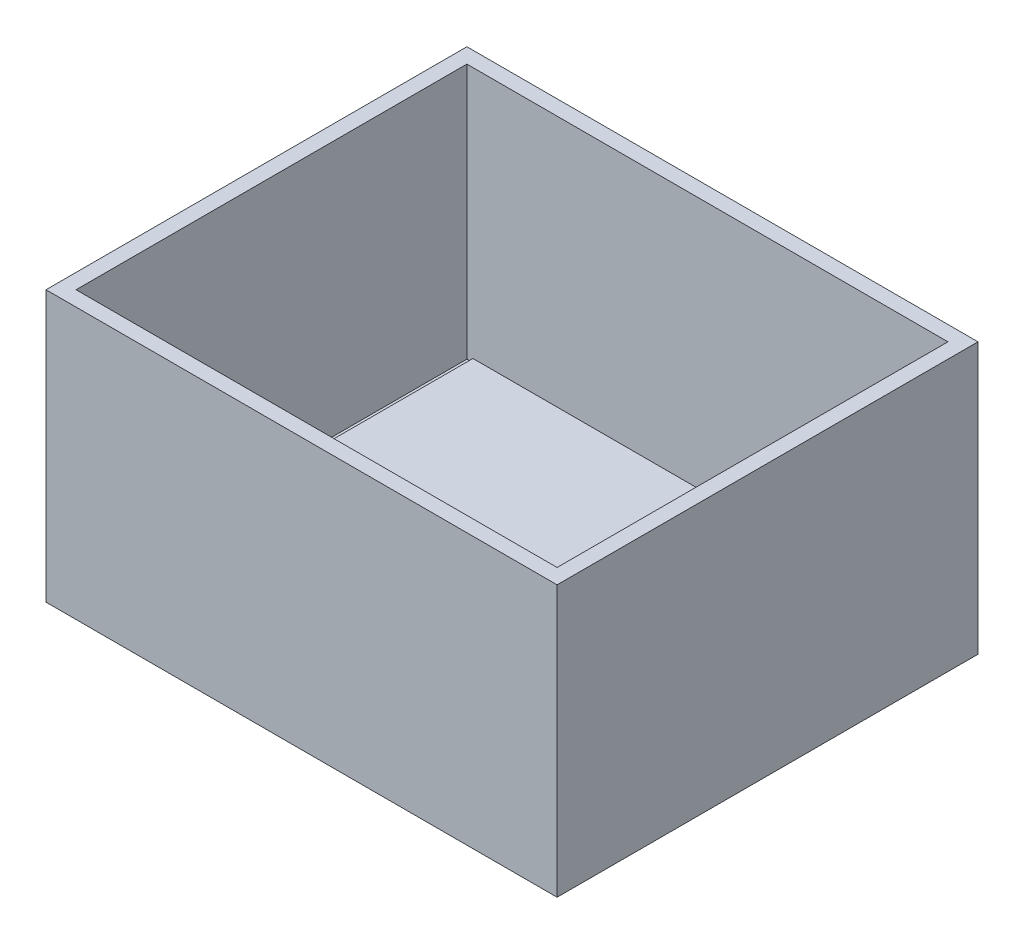
ISO-10303-21;
HEADER;
FILE_DESCRIPTION(('STEP AP214'),'2;1');
FILE_NAME('part.step','',(''),(''),'','','');
FILE_SCHEMA(('AUTOMOTIVE_DESIGN { 1 0 10303 214 1 1 1 1 }'));
ENDSEC;
DATA;
#1=APPLICATION_CONTEXT('core data for automotive mechanical design processes');
#2=APPLICATION_PROTOCOL_DEFINITION('international standard','automotive_design',2000,#1);
#3=PRODUCT_CONTEXT('',#1,'mechanical');
#4=PRODUCT('Part','Part','',(#3));
#5=PRODUCT_RELATED_PRODUCT_CATEGORY('part','',(#4));
#6=PRODUCT_DEFINITION_FORMATION('','',#4);
#7=PRODUCT_DEFINITION_CONTEXT('part definition',#1,'design');
#8=PRODUCT_DEFINITION('design','',#6,#7);
#9=PRODUCT_DEFINITION_SHAPE('','',#8);
#10=(LENGTH_UNIT() NAMED_UNIT(*) SI_UNIT(.MILLI.,.METRE.));
#11=(NAMED_UNIT(*) PLANE_ANGLE_UNIT() SI_UNIT($,.RADIAN.));
#12=(NAMED_UNIT(*) SI_UNIT($,.STERADIAN.) SOLID_ANGLE_UNIT());
#13=UNCERTAINTY_MEASURE_WITH_UNIT(LENGTH_MEASURE(1.E-05),#10,'distance_accuracy_value','');
#14=(GEOMETRIC_REPRESENTATION_CONTEXT(3) GLOBAL_UNCERTAINTY_ASSIGNED_CONTEXT((#13)) GLOBAL_UNIT_ASSIGNED_CONTEXT((#10,
#11,#12)) REPRESENTATION_CONTEXT('',''));
#15=CARTESIAN_POINT('',(0.,0.,0.));
#16=DIRECTION('',(0.,0.,1.));
#17=DIRECTION('',(1.,0.,0.));
#18=AXIS2_PLACEMENT_3D('',#15,#16,#17);
#19=CARTESIAN_POINT('',(241.6,6.,105.4));
#20=DIRECTION('',(0.,0.,-1.));
#21=DIRECTION('',(-1.,0.,0.));
#22=AXIS2_PLACEMENT_3D('',#19,#20,#21);
#23=PLANE('',#22);
#24=DIRECTION('',(0.,-1.,0.));
#25=VECTOR('',#24,1.);
#26=CARTESIAN_POINT('',(173.,6.,105.4));
#27=LINE('',#26,#25);
#28=CARTESIAN_POINT('',(173.,7.6,105.4));
#29=VERTEX_POINT('',#28);
#30=CARTESIAN_POINT('',(173.,6.,105.4));
#31=VERTEX_POINT('',#30);
#32=EDGE_CURVE('E114',#29,#31,#27,.T.);
#33=ORIENTED_EDGE('',*,*,#32,.T.);
#34=DIRECTION('',(-1.,0.,0.));
#35=VECTOR('',#34,1.);
#36=CARTESIAN_POINT('',(241.6,6.,105.4));
#37=LINE('',#36,#35);
#38=CARTESIAN_POINT('',(241.6,6.,105.4));
#39=VERTEX_POINT('',#38);
#40=EDGE_CURVE('E12',#39,#31,#37,.T.);
#41=ORIENTED_EDGE('',*,*,#40,.F.);
#42=DIRECTION('',(0.,-1.,0.));
#43=VECTOR('',#42,1.);
#44=CARTESIAN_POINT('',(241.6,6.,105.4));
#45=LINE('',#44,#43);
#46=CARTESIAN_POINT('',(241.6,7.6,105.4));
#47=VERTEX_POINT('',#46);
#48=EDGE_CURVE('E102',#47,#39,#45,.T.);
#49=ORIENTED_EDGE('',*,*,#48,.F.);
#50=DIRECTION('',(-1.,0.,0.));
#51=VECTOR('',#50,1.);
#52=CARTESIAN_POINT('',(241.6,7.6,105.4));
#53=LINE('',#52,#51);
#54=EDGE_CURVE('E110',#47,#29,#53,.T.);
#55=ORIENTED_EDGE('',*,*,#54,.T.);
#56=EDGE_LOOP('',(#33,#41,#49,#55));
#57=FACE_BOUND('',#56,.T.);
#58=ADVANCED_FACE('F51',(#57),#23,.F.);
#59=CARTESIAN_POINT('',(241.6,6.,52.));
#60=DIRECTION('',(0.,1.,0.));
#61=DIRECTION('',(0.,0.,1.));
#62=AXIS2_PLACEMENT_3D('',#59,#60,#61);
#63=PLANE('',#62);
#64=DIRECTION('',(0.,0.,-1.));
#65=VECTOR('',#64,1.);
#66=CARTESIAN_POINT('',(173.,6.,52.));
#67=LINE('',#66,#65);
#68=CARTESIAN_POINT('',(173.,6.,52.));
#69=VERTEX_POINT('',#68);
#70=EDGE_CURVE('E106',#31,#69,#67,.T.);
#71=ORIENTED_EDGE('',*,*,#70,.T.);
#72=DIRECTION('',(-1.,0.,0.));
#73=VECTOR('',#72,1.);
#74=CARTESIAN_POINT('',(241.6,6.,52.));
#75=LINE('',#74,#73);
#76=CARTESIAN_POINT('',(241.6,6.,52.));
#77=VERTEX_POINT('',#76);
#78=EDGE_CURVE('E59',#77,#69,#75,.T.);
#79=ORIENTED_EDGE('',*,*,#78,.F.);
#80=DIRECTION('',(0.,0.,-1.));
#81=VECTOR('',#80,1.);
#82=CARTESIAN_POINT('',(241.6,6.,52.));
#83=LINE('',#82,#81);
#84=EDGE_CURVE('E97',#39,#77,#83,.T.);
#85=ORIENTED_EDGE('',*,*,#84,.F.);
#86=ORIENTED_EDGE('',*,*,#40,.T.);
#87=EDGE_LOOP('',(#71,#79,#85,#86));
#88=FACE_BOUND('',#87,.T.);
#89=ADVANCED_FACE('F105',(#88),#63,.F.);
#90=CARTESIAN_POINT('',(241.6,6.,52.));
#91=DIRECTION('',(0.,0.,1.));
#92=DIRECTION('',(1.,0.,0.));
#93=AXIS2_PLACEMENT_3D('',#90,#91,#92);
#94=PLANE('',#93);
#95=DIRECTION('',(0.,1.,0.));
#96=VECTOR('',#95,1.);
#97=CARTESIAN_POINT('',(173.,6.,52.));
#98=LINE('',#97,#96);
#99=CARTESIAN_POINT('',(173.,7.6,52.));
#100=VERTEX_POINT('',#99);
#101=EDGE_CURVE('E84',#69,#100,#98,.T.);
#102=ORIENTED_EDGE('',*,*,#101,.T.);
#103=DIRECTION('',(-1.,0.,0.));
#104=VECTOR('',#103,1.);
#105=CARTESIAN_POINT('',(241.6,7.6,52.));
#106=LINE('',#105,#104);
#107=CARTESIAN_POINT('',(241.6,7.6,52.));
#108=VERTEX_POINT('',#107);
#109=EDGE_CURVE('E107',#108,#100,#106,.T.);
#110=ORIENTED_EDGE('',*,*,#109,.F.);
#111=DIRECTION('',(0.,1.,0.));
#112=VECTOR('',#111,1.);
#113=CARTESIAN_POINT('',(241.6,6.,52.));
#114=LINE('',#113,#112);
#115=EDGE_CURVE('E100',#77,#108,#114,.T.);
#116=ORIENTED_EDGE('',*,*,#115,.F.);
#117=ORIENTED_EDGE('',*,*,#78,.T.);
#118=EDGE_LOOP('',(#102,#110,#116,#117));
#119=FACE_BOUND('',#118,.T.);
#120=ADVANCED_FACE('F108',(#119),#94,.F.);
#121=CARTESIAN_POINT('',(241.6,7.6,52.));
#122=DIRECTION('',(0.,-1.,0.));
#123=DIRECTION('',(0.,0.,-1.));
#124=AXIS2_PLACEMENT_3D('',#121,#122,#123);
#125=PLANE('',#124);
#126=DIRECTION('',(0.,0.,1.));
#127=VECTOR('',#126,1.);
#128=CARTESIAN_POINT('',(173.,7.6,52.));
#129=LINE('',#128,#127);
#130=EDGE_CURVE('E90',#100,#29,#129,.T.);
#131=ORIENTED_EDGE('',*,*,#130,.T.);
#132=ORIENTED_EDGE('',*,*,#54,.F.);
#133=DIRECTION('',(0.,0.,1.));
#134=VECTOR('',#133,1.);
#135=CARTESIAN_POINT('',(241.6,7.6,52.));
#136=LINE('',#135,#134);
#137=EDGE_CURVE('E67',#108,#47,#136,.T.);
#138=ORIENTED_EDGE('',*,*,#137,.F.);
#139=ORIENTED_EDGE('',*,*,#109,.T.);
#140=EDGE_LOOP('',(#131,#132,#138,#139));
#141=FACE_BOUND('',#140,.T.);
#142=ADVANCED_FACE('F121',(#141),#125,.F.);
#143=CARTESIAN_POINT('',(241.6,0.,0.));
#144=DIRECTION('',(1.,0.,0.));
#145=DIRECTION('',(0.,0.,-1.));
#146=AXIS2_PLACEMENT_3D('',#143,#144,#145);
#147=PLANE('',#146);
#148=ORIENTED_EDGE('',*,*,#48,.T.);
#149=ORIENTED_EDGE('',*,*,#84,.T.);
#150=ORIENTED_EDGE('',*,*,#115,.T.);
#151=ORIENTED_EDGE('',*,*,#137,.T.);
#152=EDGE_LOOP('',(#148,#149,#150,#151));
#153=FACE_BOUND('',#152,.T.);
#154=ADVANCED_FACE('F98',(#153),#147,.T.);
#155=CARTESIAN_POINT('',(173.,0.,0.));
#156=DIRECTION('',(1.,0.,0.));
#157=DIRECTION('',(0.,0.,-1.));
#158=AXIS2_PLACEMENT_3D('',#155,#156,#157);
#159=PLANE('',#158);
#160=ORIENTED_EDGE('',*,*,#32,.F.);
#161=ORIENTED_EDGE('',*,*,#130,.F.);
#162=ORIENTED_EDGE('',*,*,#101,.F.);
#163=ORIENTED_EDGE('',*,*,#70,.F.);
#164=EDGE_LOOP('',(#160,#161,#162,#163));
#165=FACE_BOUND('',#164,.T.);
#166=ADVANCED_FACE('F124',(#165),#159,.F.);
#167=CLOSED_SHELL('',(#58,#89,#120,#142,#154,#166));
#168=MANIFOLD_SOLID_BREP('B2',#167);
#169=CARTESIAN_POINT('',(250.,0.,115.));
#170=DIRECTION('',(0.,0.,-1.));
#171=DIRECTION('',(-1.,0.,0.));
#172=AXIS2_PLACEMENT_3D('',#169,#170,#171);
#173=PLANE('',#172);
#174=DIRECTION('',(0.,-1.,0.));
#175=VECTOR('',#174,1.);
#176=CARTESIAN_POINT('',(165.,0.,115.));
#177=LINE('',#176,#175);
#178=CARTESIAN_POINT('',(165.,45.,115.));
#179=VERTEX_POINT('',#178);
#180=CARTESIAN_POINT('',(165.,0.,115.));
#181=VERTEX_POINT('',#180);
#182=EDGE_CURVE('E270',#179,#181,#177,.T.);
#183=ORIENTED_EDGE('',*,*,#182,.T.);
#184=DIRECTION('',(-1.,0.,0.));
#185=VECTOR('',#184,1.);
#186=CARTESIAN_POINT('',(250.,0.,115.));
#187=LINE('',#186,#185);
#188=CARTESIAN_POINT('',(250.,0.,115.));
#189=VERTEX_POINT('',#188);
#190=EDGE_CURVE('E296',#189,#181,#187,.T.);
#191=ORIENTED_EDGE('',*,*,#190,.F.);
#192=DIRECTION('',(0.,-1.,0.));
#193=VECTOR('',#192,1.);
#194=CARTESIAN_POINT('',(250.,0.,115.));
#195=LINE('',#194,#193);
#196=CARTESIAN_POINT('',(250.,45.,115.));
#197=VERTEX_POINT('',#196);
#198=EDGE_CURVE('E279',#197,#189,#195,.T.);
#199=ORIENTED_EDGE('',*,*,#198,.F.);
#200=DIRECTION('',(-1.,0.,0.));
#201=VECTOR('',#200,1.);
#202=CARTESIAN_POINT('',(250.,45.,115.));
#203=LINE('',#202,#201);
#204=EDGE_CURVE('E284',#197,#179,#203,.T.);
#205=ORIENTED_EDGE('',*,*,#204,.T.);
#206=EDGE_LOOP('',(#183,#191,#199,#205));
#207=FACE_BOUND('',#206,.T.);
#208=ADVANCED_FACE('F175',(#207),#173,.F.);
#209=CARTESIAN_POINT('',(250.,0.,45.));
#210=DIRECTION('',(0.,1.,0.));
#211=DIRECTION('',(0.,0.,1.));
#212=AXIS2_PLACEMENT_3D('',#209,#210,#211);
#213=PLANE('',#212);
#214=DIRECTION('',(0.,0.,-1.));
#215=VECTOR('',#214,1.);
#216=CARTESIAN_POINT('',(165.,0.,45.));
#217=LINE('',#216,#215);
#218=CARTESIAN_POINT('',(165.,0.,45.));
#219=VERTEX_POINT('',#218);
#220=EDGE_CURVE('E274',#181,#219,#217,.T.);
#221=ORIENTED_EDGE('',*,*,#220,.T.);
#222=DIRECTION('',(-1.,0.,0.));
#223=VECTOR('',#222,1.);
#224=CARTESIAN_POINT('',(250.,0.,45.));
#225=LINE('',#224,#223);
#226=CARTESIAN_POINT('',(250.,0.,45.));
#227=VERTEX_POINT('',#226);
#228=EDGE_CURVE('E293',#227,#219,#225,.T.);
#229=ORIENTED_EDGE('',*,*,#228,.F.);
#230=DIRECTION('',(0.,0.,-1.));
#231=VECTOR('',#230,1.);
#232=CARTESIAN_POINT('',(250.,0.,45.));
#233=LINE('',#232,#231);
#234=EDGE_CURVE('E227',#189,#227,#233,.T.);
#235=ORIENTED_EDGE('',*,*,#234,.F.);
#236=ORIENTED_EDGE('',*,*,#190,.T.);
#237=EDGE_LOOP('',(#221,#229,#235,#236));
#238=FACE_BOUND('',#237,.T.);
#239=ADVANCED_FACE('F321',(#238),#213,.F.);
#240=CARTESIAN_POINT('',(250.,0.,45.));
#241=DIRECTION('',(0.,0.,1.));
#242=DIRECTION('',(1.,0.,0.));
#243=AXIS2_PLACEMENT_3D('',#240,#241,#242);
#244=PLANE('',#243);
#245=DIRECTION('',(0.,1.,0.));
#246=VECTOR('',#245,1.);
#247=CARTESIAN_POINT('',(165.,0.,45.));
#248=LINE('',#247,#246);
#249=CARTESIAN_POINT('',(165.,45.,45.));
#250=VERTEX_POINT('',#249);
#251=EDGE_CURVE('E287',#219,#250,#248,.T.);
#252=ORIENTED_EDGE('',*,*,#251,.T.);
#253=DIRECTION('',(-1.,0.,0.));
#254=VECTOR('',#253,1.);
#255=CARTESIAN_POINT('',(250.,45.,45.));
#256=LINE('',#255,#254);
#257=CARTESIAN_POINT('',(250.,45.,45.));
#258=VERTEX_POINT('',#257);
#259=EDGE_CURVE('E291',#258,#250,#256,.T.);
#260=ORIENTED_EDGE('',*,*,#259,.F.);
#261=DIRECTION('',(0.,1.,0.));
#262=VECTOR('',#261,1.);
#263=CARTESIAN_POINT('',(250.,0.,45.));
#264=LINE('',#263,#262);
#265=EDGE_CURVE('E282',#227,#258,#264,.T.);
#266=ORIENTED_EDGE('',*,*,#265,.F.);
#267=ORIENTED_EDGE('',*,*,#228,.T.);
#268=EDGE_LOOP('',(#252,#260,#266,#267));
#269=FACE_BOUND('',#268,.T.);
#270=ADVANCED_FACE('F326',(#269),#244,.F.);
#271=CARTESIAN_POINT('',(250.,45.,45.));
#272=DIRECTION('',(0.,-1.,0.));
#273=DIRECTION('',(0.,0.,-1.));
#274=AXIS2_PLACEMENT_3D('',#271,#272,#273);
#275=PLANE('',#274);
#276=DIRECTION('',(-1.,0.,0.));
#277=VECTOR('',#276,1.);
#278=CARTESIAN_POINT('',(250.,45.,47.5));
#279=LINE('',#278,#277);
#280=CARTESIAN_POINT('',(247.5,45.,47.5));
#281=VERTEX_POINT('',#280);
#282=CARTESIAN_POINT('',(167.5,45.,47.5));
#283=VERTEX_POINT('',#282);
#284=EDGE_CURVE('E300',#281,#283,#279,.T.);
#285=ORIENTED_EDGE('',*,*,#284,.F.);
#286=DIRECTION('',(0.,0.,1.));
#287=VECTOR('',#286,1.);
#288=CARTESIAN_POINT('',(247.5,45.,45.));
#289=LINE('',#288,#287);
#290=CARTESIAN_POINT('',(247.5,45.,112.5));
#291=VERTEX_POINT('',#290);
#292=EDGE_CURVE('E49',#281,#291,#289,.T.);
#293=ORIENTED_EDGE('',*,*,#292,.T.);
#294=DIRECTION('',(1.,0.,0.));
#295=VECTOR('',#294,1.);
#296=CARTESIAN_POINT('',(250.,45.,112.5));
#297=LINE('',#296,#295);
#298=CARTESIAN_POINT('',(167.5,45.,112.5));
#299=VERTEX_POINT('',#298);
#300=EDGE_CURVE('E182',#299,#291,#297,.T.);
#301=ORIENTED_EDGE('',*,*,#300,.F.);
#302=DIRECTION('',(0.,0.,1.));
#303=VECTOR('',#302,1.);
#304=CARTESIAN_POINT('',(167.5,45.,45.));
#305=LINE('',#304,#303);
#306=EDGE_CURVE('E298',#283,#299,#305,.T.);
#307=ORIENTED_EDGE('',*,*,#306,.F.);
#308=EDGE_LOOP('',(#285,#293,#301,#307));
#309=FACE_BOUND('',#308,.T.);
#310=DIRECTION('',(0.,0.,1.));
#311=VECTOR('',#310,1.);
#312=CARTESIAN_POINT('',(165.,45.,45.));
#313=LINE('',#312,#311);
#314=EDGE_CURVE('E219',#250,#179,#313,.T.);
#315=ORIENTED_EDGE('',*,*,#314,.T.);
#316=ORIENTED_EDGE('',*,*,#204,.F.);
#317=DIRECTION('',(0.,0.,1.));
#318=VECTOR('',#317,1.);
#319=CARTESIAN_POINT('',(250.,45.,45.));
#320=LINE('',#319,#318);
#321=EDGE_CURVE('E198',#258,#197,#320,.T.);
#322=ORIENTED_EDGE('',*,*,#321,.F.);
#323=ORIENTED_EDGE('',*,*,#259,.T.);
#324=EDGE_LOOP('',(#315,#316,#322,#323));
#325=FACE_BOUND('',#324,.T.);
#326=ADVANCED_FACE('F306',(#309,#325),#275,.F.);
#327=CARTESIAN_POINT('',(250.,0.,0.));
#328=DIRECTION('',(1.,0.,0.));
#329=DIRECTION('',(0.,0.,-1.));
#330=AXIS2_PLACEMENT_3D('',#327,#328,#329);
#331=PLANE('',#330);
#332=ORIENTED_EDGE('',*,*,#198,.T.);
#333=ORIENTED_EDGE('',*,*,#234,.T.);
#334=ORIENTED_EDGE('',*,*,#265,.T.);
#335=ORIENTED_EDGE('',*,*,#321,.T.);
#336=EDGE_LOOP('',(#332,#333,#334,#335));
#337=FACE_BOUND('',#336,.T.);
#338=ADVANCED_FACE('F336',(#337),#331,.T.);
#339=CARTESIAN_POINT('',(165.,0.,0.));
#340=DIRECTION('',(1.,0.,0.));
#341=DIRECTION('',(0.,0.,-1.));
#342=AXIS2_PLACEMENT_3D('',#339,#340,#341);
#343=PLANE('',#342);
#344=ORIENTED_EDGE('',*,*,#182,.F.);
#345=ORIENTED_EDGE('',*,*,#314,.F.);
#346=ORIENTED_EDGE('',*,*,#251,.F.);
#347=ORIENTED_EDGE('',*,*,#220,.F.);
#348=EDGE_LOOP('',(#344,#345,#346,#347));
#349=FACE_BOUND('',#348,.T.);
#350=ADVANCED_FACE('F331',(#349),#343,.F.);
#351=CARTESIAN_POINT('',(247.5,2.5,112.5));
#352=DIRECTION('',(0.,0.,-1.));
#353=DIRECTION('',(-1.,0.,0.));
#354=AXIS2_PLACEMENT_3D('',#351,#352,#353);
#355=PLANE('',#354);
#356=ORIENTED_EDGE('',*,*,#300,.T.);
#357=DIRECTION('',(0.,-1.,0.));
#358=VECTOR('',#357,1.);
#359=CARTESIAN_POINT('',(247.5,2.5,112.5));
#360=LINE('',#359,#358);
#361=CARTESIAN_POINT('',(247.5,2.5,112.5));
#362=VERTEX_POINT('',#361);
#363=EDGE_CURVE('E249',#291,#362,#360,.T.);
#364=ORIENTED_EDGE('',*,*,#363,.T.);
#365=DIRECTION('',(-1.,0.,0.));
#366=VECTOR('',#365,1.);
#367=CARTESIAN_POINT('',(247.5,2.5,112.5));
#368=LINE('',#367,#366);
#369=CARTESIAN_POINT('',(167.5,2.5,112.5));
#370=VERTEX_POINT('',#369);
#371=EDGE_CURVE('E254',#362,#370,#368,.T.);
#372=ORIENTED_EDGE('',*,*,#371,.T.);
#373=DIRECTION('',(0.,-1.,0.));
#374=VECTOR('',#373,1.);
#375=CARTESIAN_POINT('',(167.5,2.5,112.5));
#376=LINE('',#375,#374);
#377=EDGE_CURVE('E308',#299,#370,#376,.T.);
#378=ORIENTED_EDGE('',*,*,#377,.F.);
#379=EDGE_LOOP('',(#356,#364,#372,#378));
#380=FACE_BOUND('',#379,.T.);
#381=ADVANCED_FACE('F251',(#380),#355,.T.);
#382=CARTESIAN_POINT('',(247.5,2.5,47.5));
#383=DIRECTION('',(0.,0.,1.));
#384=DIRECTION('',(1.,0.,0.));
#385=AXIS2_PLACEMENT_3D('',#382,#383,#384);
#386=PLANE('',#385);
#387=ORIENTED_EDGE('',*,*,#284,.T.);
#388=DIRECTION('',(0.,1.,0.));
#389=VECTOR('',#388,1.);
#390=CARTESIAN_POINT('',(167.5,2.5,47.5));
#391=LINE('',#390,#389);
#392=CARTESIAN_POINT('',(167.5,2.5,47.5));
#393=VERTEX_POINT('',#392);
#394=EDGE_CURVE('E189',#393,#283,#391,.T.);
#395=ORIENTED_EDGE('',*,*,#394,.F.);
#396=DIRECTION('',(-1.,0.,0.));
#397=VECTOR('',#396,1.);
#398=CARTESIAN_POINT('',(247.5,2.5,47.5));
#399=LINE('',#398,#397);
#400=CARTESIAN_POINT('',(247.5,2.5,47.5));
#401=VERTEX_POINT('',#400);
#402=EDGE_CURVE('E271',#401,#393,#399,.T.);
#403=ORIENTED_EDGE('',*,*,#402,.F.);
#404=DIRECTION('',(0.,1.,0.));
#405=VECTOR('',#404,1.);
#406=CARTESIAN_POINT('',(247.5,2.5,47.5));
#407=LINE('',#406,#405);
#408=EDGE_CURVE('E262',#401,#281,#407,.T.);
#409=ORIENTED_EDGE('',*,*,#408,.T.);
#410=EDGE_LOOP('',(#387,#395,#403,#409));
#411=FACE_BOUND('',#410,.T.);
#412=ADVANCED_FACE('F304',(#411),#386,.T.);
#413=CARTESIAN_POINT('',(247.5,0.,0.));
#414=DIRECTION('',(1.,0.,0.));
#415=DIRECTION('',(0.,0.,-1.));
#416=AXIS2_PLACEMENT_3D('',#413,#414,#415);
#417=PLANE('',#416);
#418=ORIENTED_EDGE('',*,*,#408,.F.);
#419=DIRECTION('',(0.,0.,-1.));
#420=VECTOR('',#419,1.);
#421=CARTESIAN_POINT('',(247.5,2.5,47.5));
#422=LINE('',#421,#420);
#423=EDGE_CURVE('E257',#362,#401,#422,.T.);
#424=ORIENTED_EDGE('',*,*,#423,.F.);
#425=ORIENTED_EDGE('',*,*,#363,.F.);
#426=ORIENTED_EDGE('',*,*,#292,.F.);
#427=EDGE_LOOP('',(#418,#424,#425,#426));
#428=FACE_BOUND('',#427,.T.);
#429=ADVANCED_FACE('F260',(#428),#417,.F.);
#430=CARTESIAN_POINT('',(167.5,0.,0.));
#431=DIRECTION('',(1.,0.,0.));
#432=DIRECTION('',(0.,0.,-1.));
#433=AXIS2_PLACEMENT_3D('',#430,#431,#432);
#434=PLANE('',#433);
#435=ORIENTED_EDGE('',*,*,#306,.T.);
#436=ORIENTED_EDGE('',*,*,#377,.T.);
#437=DIRECTION('',(0.,0.,-1.));
#438=VECTOR('',#437,1.);
#439=CARTESIAN_POINT('',(167.5,2.5,47.5));
#440=LINE('',#439,#438);
#441=EDGE_CURVE('E269',#370,#393,#440,.T.);
#442=ORIENTED_EDGE('',*,*,#441,.T.);
#443=ORIENTED_EDGE('',*,*,#394,.T.);
#444=EDGE_LOOP('',(#435,#436,#442,#443));
#445=FACE_BOUND('',#444,.T.);
#446=ADVANCED_FACE('F307',(#445),#434,.T.);
#447=CARTESIAN_POINT('',(247.5,2.5,47.5));
#448=DIRECTION('',(0.,1.,0.));
#449=DIRECTION('',(0.,0.,1.));
#450=AXIS2_PLACEMENT_3D('',#447,#448,#449);
#451=PLANE('',#450);
#452=ORIENTED_EDGE('',*,*,#441,.F.);
#453=ORIENTED_EDGE('',*,*,#371,.F.);
#454=ORIENTED_EDGE('',*,*,#423,.T.);
#455=ORIENTED_EDGE('',*,*,#402,.T.);
#456=EDGE_LOOP('',(#452,#453,#454,#455));
#457=FACE_BOUND('',#456,.T.);
#458=ADVANCED_FACE('F268',(#457),#451,.T.);
#459=CLOSED_SHELL('',(#208,#239,#270,#326,#338,#350,#381,#412,#429,#446,#458));
#460=MANIFOLD_SOLID_BREP('B6',#459);
#461=ADVANCED_BREP_SHAPE_REPRESENTATION('',(#18,#168,#460),#14);
#462=SHAPE_DEFINITION_REPRESENTATION(#9,#461);
ENDSEC;
END-ISO-10303-21;
